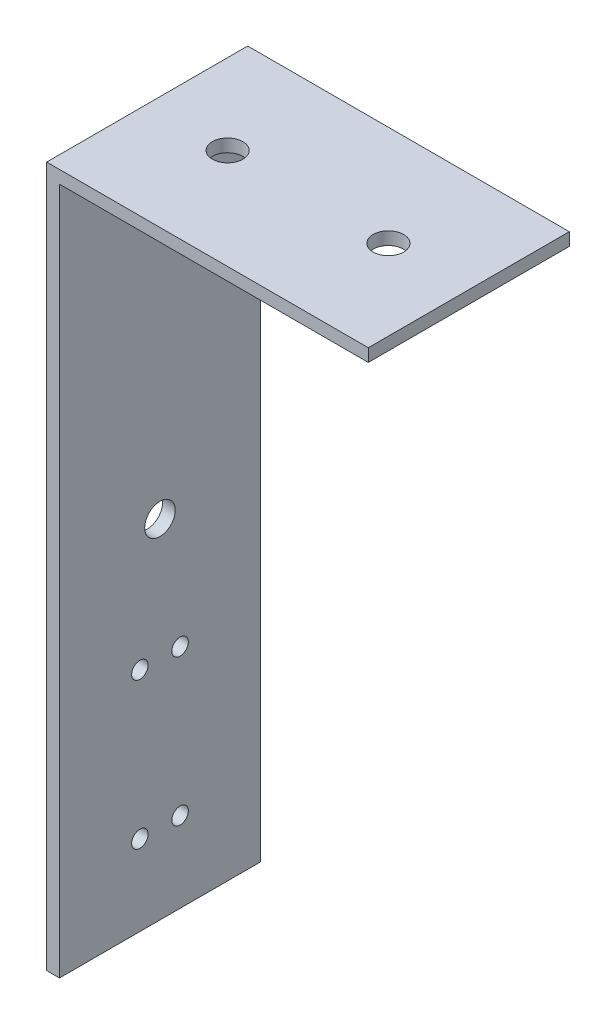
ISO-10303-21;
HEADER;
FILE_DESCRIPTION(('STEP AP214'),'2;1');
FILE_NAME('part.step','',(''),(''),'','','');
FILE_SCHEMA(('AUTOMOTIVE_DESIGN { 1 0 10303 214 1 1 1 1 }'));
ENDSEC;
DATA;
#1=APPLICATION_CONTEXT('core data for automotive mechanical design processes');
#2=APPLICATION_PROTOCOL_DEFINITION('international standard','automotive_design',2000,#1);
#3=PRODUCT_CONTEXT('',#1,'mechanical');
#4=PRODUCT('Part','Part','',(#3));
#5=PRODUCT_RELATED_PRODUCT_CATEGORY('part','',(#4));
#6=PRODUCT_DEFINITION_FORMATION('','',#4);
#7=PRODUCT_DEFINITION_CONTEXT('part definition',#1,'design');
#8=PRODUCT_DEFINITION('design','',#6,#7);
#9=PRODUCT_DEFINITION_SHAPE('','',#8);
#10=(LENGTH_UNIT() NAMED_UNIT(*) SI_UNIT(.MILLI.,.METRE.));
#11=(NAMED_UNIT(*) PLANE_ANGLE_UNIT() SI_UNIT($,.RADIAN.));
#12=(NAMED_UNIT(*) SI_UNIT($,.STERADIAN.) SOLID_ANGLE_UNIT());
#13=UNCERTAINTY_MEASURE_WITH_UNIT(LENGTH_MEASURE(1.E-05),#10,'distance_accuracy_value','');
#14=(GEOMETRIC_REPRESENTATION_CONTEXT(3) GLOBAL_UNCERTAINTY_ASSIGNED_CONTEXT((#13)) GLOBAL_UNIT_ASSIGNED_CONTEXT((#10,
#11,#12)) REPRESENTATION_CONTEXT('',''));
#15=CARTESIAN_POINT('',(0.,0.,0.));
#16=DIRECTION('',(0.,0.,1.));
#17=DIRECTION('',(1.,0.,0.));
#18=AXIS2_PLACEMENT_3D('',#15,#16,#17);
#19=CARTESIAN_POINT('',(0.,0.,25.));
#20=DIRECTION('',(0.,1.,0.));
#21=DIRECTION('',(0.,0.,1.));
#22=AXIS2_PLACEMENT_3D('',#19,#20,#21);
#23=PLANE('',#22);
#24=DIRECTION('',(1.,0.,0.));
#25=VECTOR('',#24,1.);
#26=CARTESIAN_POINT('',(0.,0.,0.));
#27=LINE('',#26,#25);
#28=CARTESIAN_POINT('',(0.,0.,0.));
#29=VERTEX_POINT('',#28);
#30=CARTESIAN_POINT('',(1.5875,0.,0.));
#31=VERTEX_POINT('',#30);
#32=EDGE_CURVE('E119',#29,#31,#27,.T.);
#33=ORIENTED_EDGE('',*,*,#32,.T.);
#34=DIRECTION('',(0.,0.,-1.));
#35=VECTOR('',#34,1.);
#36=CARTESIAN_POINT('',(1.5875,0.,25.));
#37=LINE('',#36,#35);
#38=CARTESIAN_POINT('',(1.5875,0.,25.));
#39=VERTEX_POINT('',#38);
#40=EDGE_CURVE('E11',#39,#31,#37,.T.);
#41=ORIENTED_EDGE('',*,*,#40,.F.);
#42=DIRECTION('',(1.,0.,0.));
#43=VECTOR('',#42,1.);
#44=CARTESIAN_POINT('',(0.,0.,25.));
#45=LINE('',#44,#43);
#46=CARTESIAN_POINT('',(0.,0.,25.));
#47=VERTEX_POINT('',#46);
#48=EDGE_CURVE('E130',#47,#39,#45,.T.);
#49=ORIENTED_EDGE('',*,*,#48,.F.);
#50=DIRECTION('',(0.,0.,-1.));
#51=VECTOR('',#50,1.);
#52=CARTESIAN_POINT('',(0.,0.,25.));
#53=LINE('',#52,#51);
#54=EDGE_CURVE('E115',#47,#29,#53,.T.);
#55=ORIENTED_EDGE('',*,*,#54,.T.);
#56=EDGE_LOOP('',(#33,#41,#49,#55));
#57=FACE_BOUND('',#56,.T.);
#58=ADVANCED_FACE('F35',(#57),#23,.F.);
#59=CARTESIAN_POINT('',(1.5875,0.,25.));
#60=DIRECTION('',(-1.,0.,0.));
#61=DIRECTION('',(0.,0.,1.));
#62=AXIS2_PLACEMENT_3D('',#59,#60,#61);
#63=PLANE('',#62);
#64=CARTESIAN_POINT('',(1.5875,43.2,12.5));
#65=DIRECTION('',(-1.,0.,0.));
#66=DIRECTION('',(0.,0.,1.));
#67=AXIS2_PLACEMENT_3D('',#64,#65,#66);
#68=CIRCLE('',#67,1.89864999999999);
#69=CARTESIAN_POINT('',(1.5875,43.2,14.39865));
#70=VERTEX_POINT('',#69);
#71=EDGE_CURVE('E282',#70,#70,#68,.T.);
#72=ORIENTED_EDGE('',*,*,#71,.T.);
#73=EDGE_LOOP('',(#72));
#74=FACE_BOUND('',#73,.T.);
#75=CARTESIAN_POINT('',(1.5875,9.99999999999999,15.));
#76=DIRECTION('',(-1.,0.,0.));
#77=DIRECTION('',(0.,0.,1.));
#78=AXIS2_PLACEMENT_3D('',#75,#76,#77);
#79=CIRCLE('',#78,1.0287);
#80=CARTESIAN_POINT('',(1.5875,9.99999999999999,16.0287));
#81=VERTEX_POINT('',#80);
#82=EDGE_CURVE('E286',#81,#81,#79,.T.);
#83=ORIENTED_EDGE('',*,*,#82,.T.);
#84=EDGE_LOOP('',(#83));
#85=FACE_BOUND('',#84,.T.);
#86=CARTESIAN_POINT('',(1.5875,28.2,15.));
#87=DIRECTION('',(-1.,0.,0.));
#88=DIRECTION('',(0.,0.,1.));
#89=AXIS2_PLACEMENT_3D('',#86,#87,#88);
#90=CIRCLE('',#89,1.0287);
#91=CARTESIAN_POINT('',(1.5875,28.2,16.0287));
#92=VERTEX_POINT('',#91);
#93=EDGE_CURVE('E295',#92,#92,#90,.T.);
#94=ORIENTED_EDGE('',*,*,#93,.T.);
#95=EDGE_LOOP('',(#94));
#96=FACE_BOUND('',#95,.T.);
#97=CARTESIAN_POINT('',(1.5875,10.,10.));
#98=DIRECTION('',(-1.,0.,0.));
#99=DIRECTION('',(0.,0.,1.));
#100=AXIS2_PLACEMENT_3D('',#97,#98,#99);
#101=CIRCLE('',#100,1.0287);
#102=CARTESIAN_POINT('',(1.5875,10.,11.0287));
#103=VERTEX_POINT('',#102);
#104=EDGE_CURVE('E301',#103,#103,#101,.T.);
#105=ORIENTED_EDGE('',*,*,#104,.T.);
#106=EDGE_LOOP('',(#105));
#107=FACE_BOUND('',#106,.T.);
#108=CARTESIAN_POINT('',(1.5875,28.2,10.));
#109=DIRECTION('',(-1.,0.,0.));
#110=DIRECTION('',(0.,0.,1.));
#111=AXIS2_PLACEMENT_3D('',#108,#109,#110);
#112=CIRCLE('',#111,1.0287);
#113=CARTESIAN_POINT('',(1.5875,28.2,11.0287));
#114=VERTEX_POINT('',#113);
#115=EDGE_CURVE('E307',#114,#114,#112,.T.);
#116=ORIENTED_EDGE('',*,*,#115,.T.);
#117=EDGE_LOOP('',(#116));
#118=FACE_BOUND('',#117,.T.);
#119=DIRECTION('',(0.,1.,0.));
#120=VECTOR('',#119,1.);
#121=CARTESIAN_POINT('',(1.5875,0.,0.));
#122=LINE('',#121,#120);
#123=CARTESIAN_POINT('',(1.5875,85.5125,0.));
#124=VERTEX_POINT('',#123);
#125=EDGE_CURVE('E122',#31,#124,#122,.T.);
#126=ORIENTED_EDGE('',*,*,#125,.T.);
#127=DIRECTION('',(0.,0.,-1.));
#128=VECTOR('',#127,1.);
#129=CARTESIAN_POINT('',(1.5875,85.5125,25.));
#130=LINE('',#129,#128);
#131=CARTESIAN_POINT('',(1.5875,85.5125,25.));
#132=VERTEX_POINT('',#131);
#133=EDGE_CURVE('E43',#132,#124,#130,.T.);
#134=ORIENTED_EDGE('',*,*,#133,.F.);
#135=DIRECTION('',(0.,1.,0.));
#136=VECTOR('',#135,1.);
#137=CARTESIAN_POINT('',(1.5875,0.,25.));
#138=LINE('',#137,#136);
#139=EDGE_CURVE('E88',#39,#132,#138,.T.);
#140=ORIENTED_EDGE('',*,*,#139,.F.);
#141=ORIENTED_EDGE('',*,*,#40,.T.);
#142=EDGE_LOOP('',(#126,#134,#140,#141));
#143=FACE_BOUND('',#142,.T.);
#144=ADVANCED_FACE('F158',(#74,#85,#96,#107,#118,#143),#63,.F.);
#145=CARTESIAN_POINT('',(1.5875,85.5125,25.));
#146=DIRECTION('',(0.,1.,0.));
#147=DIRECTION('',(0.,0.,1.));
#148=AXIS2_PLACEMENT_3D('',#145,#146,#147);
#149=PLANE('',#148);
#150=CARTESIAN_POINT('',(10.,85.5125,12.5));
#151=DIRECTION('',(0.,1.,0.));
#152=DIRECTION('',(0.,0.,1.));
#153=AXIS2_PLACEMENT_3D('',#150,#151,#152);
#154=CIRCLE('',#153,1.89864999999999);
#155=CARTESIAN_POINT('',(10.,85.5125,14.39865));
#156=VERTEX_POINT('',#155);
#157=EDGE_CURVE('E313',#156,#156,#154,.T.);
#158=ORIENTED_EDGE('',*,*,#157,.T.);
#159=EDGE_LOOP('',(#158));
#160=FACE_BOUND('',#159,.T.);
#161=CARTESIAN_POINT('',(30.,85.5125,12.5));
#162=DIRECTION('',(0.,1.,0.));
#163=DIRECTION('',(0.,0.,1.));
#164=AXIS2_PLACEMENT_3D('',#161,#162,#163);
#165=CIRCLE('',#164,1.89864999999999);
#166=CARTESIAN_POINT('',(30.,85.5125,14.39865));
#167=VERTEX_POINT('',#166);
#168=EDGE_CURVE('E123',#167,#167,#165,.T.);
#169=ORIENTED_EDGE('',*,*,#168,.T.);
#170=EDGE_LOOP('',(#169));
#171=FACE_BOUND('',#170,.T.);
#172=DIRECTION('',(1.,0.,0.));
#173=VECTOR('',#172,1.);
#174=CARTESIAN_POINT('',(1.5875,85.5125,0.));
#175=LINE('',#174,#173);
#176=CARTESIAN_POINT('',(40.,85.5125,0.));
#177=VERTEX_POINT('',#176);
#178=EDGE_CURVE('E125',#124,#177,#175,.T.);
#179=ORIENTED_EDGE('',*,*,#178,.T.);
#180=DIRECTION('',(0.,0.,-1.));
#181=VECTOR('',#180,1.);
#182=CARTESIAN_POINT('',(40.,85.5125,25.));
#183=LINE('',#182,#181);
#184=CARTESIAN_POINT('',(40.,85.5125,25.));
#185=VERTEX_POINT('',#184);
#186=EDGE_CURVE('E110',#185,#177,#183,.T.);
#187=ORIENTED_EDGE('',*,*,#186,.F.);
#188=DIRECTION('',(1.,0.,0.));
#189=VECTOR('',#188,1.);
#190=CARTESIAN_POINT('',(1.5875,85.5125,25.));
#191=LINE('',#190,#189);
#192=EDGE_CURVE('E101',#132,#185,#191,.T.);
#193=ORIENTED_EDGE('',*,*,#192,.F.);
#194=ORIENTED_EDGE('',*,*,#133,.T.);
#195=EDGE_LOOP('',(#179,#187,#193,#194));
#196=FACE_BOUND('',#195,.T.);
#197=ADVANCED_FACE('F136',(#160,#171,#196),#149,.F.);
#198=CARTESIAN_POINT('',(40.,87.1,25.));
#199=DIRECTION('',(-1.,0.,0.));
#200=DIRECTION('',(0.,0.,1.));
#201=AXIS2_PLACEMENT_3D('',#198,#199,#200);
#202=PLANE('',#201);
#203=DIRECTION('',(0.,1.,0.));
#204=VECTOR('',#203,1.);
#205=CARTESIAN_POINT('',(40.,87.1,0.));
#206=LINE('',#205,#204);
#207=CARTESIAN_POINT('',(40.,87.1,0.));
#208=VERTEX_POINT('',#207);
#209=EDGE_CURVE('E109',#177,#208,#206,.T.);
#210=ORIENTED_EDGE('',*,*,#209,.T.);
#211=DIRECTION('',(0.,0.,-1.));
#212=VECTOR('',#211,1.);
#213=CARTESIAN_POINT('',(40.,87.1,25.));
#214=LINE('',#213,#212);
#215=CARTESIAN_POINT('',(40.,87.1,25.));
#216=VERTEX_POINT('',#215);
#217=EDGE_CURVE('E106',#216,#208,#214,.T.);
#218=ORIENTED_EDGE('',*,*,#217,.F.);
#219=DIRECTION('',(0.,1.,0.));
#220=VECTOR('',#219,1.);
#221=CARTESIAN_POINT('',(40.,87.1,25.));
#222=LINE('',#221,#220);
#223=EDGE_CURVE('E95',#185,#216,#222,.T.);
#224=ORIENTED_EDGE('',*,*,#223,.F.);
#225=ORIENTED_EDGE('',*,*,#186,.T.);
#226=EDGE_LOOP('',(#210,#218,#224,#225));
#227=FACE_BOUND('',#226,.T.);
#228=ADVANCED_FACE('F107',(#227),#202,.F.);
#229=CARTESIAN_POINT('',(0.,87.1,25.));
#230=DIRECTION('',(0.,-1.,0.));
#231=DIRECTION('',(0.,0.,-1.));
#232=AXIS2_PLACEMENT_3D('',#229,#230,#231);
#233=PLANE('',#232);
#234=CARTESIAN_POINT('',(10.,87.1,12.5));
#235=DIRECTION('',(0.,1.,0.));
#236=DIRECTION('',(0.,0.,1.));
#237=AXIS2_PLACEMENT_3D('',#234,#235,#236);
#238=CIRCLE('',#237,1.89865);
#239=CARTESIAN_POINT('',(10.,87.1,14.39865));
#240=VERTEX_POINT('',#239);
#241=EDGE_CURVE('E310',#240,#240,#238,.T.);
#242=ORIENTED_EDGE('',*,*,#241,.F.);
#243=EDGE_LOOP('',(#242));
#244=FACE_BOUND('',#243,.T.);
#245=CARTESIAN_POINT('',(30.,87.1,12.5));
#246=DIRECTION('',(0.,1.,0.));
#247=DIRECTION('',(0.,0.,1.));
#248=AXIS2_PLACEMENT_3D('',#245,#246,#247);
#249=CIRCLE('',#248,1.89865);
#250=CARTESIAN_POINT('',(30.,87.1,14.39865));
#251=VERTEX_POINT('',#250);
#252=EDGE_CURVE('E316',#251,#251,#249,.T.);
#253=ORIENTED_EDGE('',*,*,#252,.F.);
#254=EDGE_LOOP('',(#253));
#255=FACE_BOUND('',#254,.T.);
#256=DIRECTION('',(-1.,0.,0.));
#257=VECTOR('',#256,1.);
#258=CARTESIAN_POINT('',(0.,87.1,0.));
#259=LINE('',#258,#257);
#260=CARTESIAN_POINT('',(0.,87.1,0.));
#261=VERTEX_POINT('',#260);
#262=EDGE_CURVE('E74',#208,#261,#259,.T.);
#263=ORIENTED_EDGE('',*,*,#262,.T.);
#264=DIRECTION('',(0.,0.,-1.));
#265=VECTOR('',#264,1.);
#266=CARTESIAN_POINT('',(0.,87.1,25.));
#267=LINE('',#266,#265);
#268=CARTESIAN_POINT('',(0.,87.1,25.));
#269=VERTEX_POINT('',#268);
#270=EDGE_CURVE('E111',#269,#261,#267,.T.);
#271=ORIENTED_EDGE('',*,*,#270,.F.);
#272=DIRECTION('',(-1.,0.,0.));
#273=VECTOR('',#272,1.);
#274=CARTESIAN_POINT('',(0.,87.1,25.));
#275=LINE('',#274,#273);
#276=EDGE_CURVE('E99',#216,#269,#275,.T.);
#277=ORIENTED_EDGE('',*,*,#276,.F.);
#278=ORIENTED_EDGE('',*,*,#217,.T.);
#279=EDGE_LOOP('',(#263,#271,#277,#278));
#280=FACE_BOUND('',#279,.T.);
#281=ADVANCED_FACE('F113',(#244,#255,#280),#233,.F.);
#282=CARTESIAN_POINT('',(0.,0.,25.));
#283=DIRECTION('',(1.,0.,0.));
#284=DIRECTION('',(0.,0.,-1.));
#285=AXIS2_PLACEMENT_3D('',#282,#283,#284);
#286=PLANE('',#285);
#287=CARTESIAN_POINT('',(0.,43.2,12.5));
#288=DIRECTION('',(-1.,0.,0.));
#289=DIRECTION('',(0.,0.,1.));
#290=AXIS2_PLACEMENT_3D('',#287,#288,#289);
#291=CIRCLE('',#290,1.89864999999999);
#292=CARTESIAN_POINT('',(0.,43.2,14.39865));
#293=VERTEX_POINT('',#292);
#294=EDGE_CURVE('E280',#293,#293,#291,.T.);
#295=ORIENTED_EDGE('',*,*,#294,.F.);
#296=EDGE_LOOP('',(#295));
#297=FACE_BOUND('',#296,.T.);
#298=CARTESIAN_POINT('',(0.,9.99999999999999,15.));
#299=DIRECTION('',(-1.,0.,0.));
#300=DIRECTION('',(0.,0.,1.));
#301=AXIS2_PLACEMENT_3D('',#298,#299,#300);
#302=CIRCLE('',#301,1.0287);
#303=CARTESIAN_POINT('',(0.,9.99999999999999,16.0287));
#304=VERTEX_POINT('',#303);
#305=EDGE_CURVE('E283',#304,#304,#302,.T.);
#306=ORIENTED_EDGE('',*,*,#305,.F.);
#307=EDGE_LOOP('',(#306));
#308=FACE_BOUND('',#307,.T.);
#309=CARTESIAN_POINT('',(0.,28.2,15.));
#310=DIRECTION('',(-1.,0.,0.));
#311=DIRECTION('',(0.,0.,1.));
#312=AXIS2_PLACEMENT_3D('',#309,#310,#311);
#313=CIRCLE('',#312,1.0287);
#314=CARTESIAN_POINT('',(0.,28.2,16.0287));
#315=VERTEX_POINT('',#314);
#316=EDGE_CURVE('E292',#315,#315,#313,.T.);
#317=ORIENTED_EDGE('',*,*,#316,.F.);
#318=EDGE_LOOP('',(#317));
#319=FACE_BOUND('',#318,.T.);
#320=CARTESIAN_POINT('',(0.,10.,10.));
#321=DIRECTION('',(-1.,0.,0.));
#322=DIRECTION('',(0.,0.,1.));
#323=AXIS2_PLACEMENT_3D('',#320,#321,#322);
#324=CIRCLE('',#323,1.0287);
#325=CARTESIAN_POINT('',(0.,10.,11.0287));
#326=VERTEX_POINT('',#325);
#327=EDGE_CURVE('E298',#326,#326,#324,.T.);
#328=ORIENTED_EDGE('',*,*,#327,.F.);
#329=EDGE_LOOP('',(#328));
#330=FACE_BOUND('',#329,.T.);
#331=CARTESIAN_POINT('',(0.,28.2,10.));
#332=DIRECTION('',(-1.,0.,0.));
#333=DIRECTION('',(0.,0.,1.));
#334=AXIS2_PLACEMENT_3D('',#331,#332,#333);
#335=CIRCLE('',#334,1.0287);
#336=CARTESIAN_POINT('',(0.,28.2,11.0287));
#337=VERTEX_POINT('',#336);
#338=EDGE_CURVE('E304',#337,#337,#335,.T.);
#339=ORIENTED_EDGE('',*,*,#338,.F.);
#340=EDGE_LOOP('',(#339));
#341=FACE_BOUND('',#340,.T.);
#342=DIRECTION('',(0.,-1.,0.));
#343=VECTOR('',#342,1.);
#344=CARTESIAN_POINT('',(0.,0.,0.));
#345=LINE('',#344,#343);
#346=EDGE_CURVE('E80',#261,#29,#345,.T.);
#347=ORIENTED_EDGE('',*,*,#346,.T.);
#348=ORIENTED_EDGE('',*,*,#54,.F.);
#349=DIRECTION('',(0.,-1.,0.));
#350=VECTOR('',#349,1.);
#351=CARTESIAN_POINT('',(0.,0.,25.));
#352=LINE('',#351,#350);
#353=EDGE_CURVE('E51',#269,#47,#352,.T.);
#354=ORIENTED_EDGE('',*,*,#353,.F.);
#355=ORIENTED_EDGE('',*,*,#270,.T.);
#356=EDGE_LOOP('',(#347,#348,#354,#355));
#357=FACE_BOUND('',#356,.T.);
#358=ADVANCED_FACE('F143',(#297,#308,#319,#330,#341,#357),#286,.F.);
#359=CARTESIAN_POINT('',(0.,0.,25.));
#360=DIRECTION('',(0.,0.,1.));
#361=DIRECTION('',(1.,0.,0.));
#362=AXIS2_PLACEMENT_3D('',#359,#360,#361);
#363=PLANE('',#362);
#364=ORIENTED_EDGE('',*,*,#48,.T.);
#365=ORIENTED_EDGE('',*,*,#139,.T.);
#366=ORIENTED_EDGE('',*,*,#192,.T.);
#367=ORIENTED_EDGE('',*,*,#223,.T.);
#368=ORIENTED_EDGE('',*,*,#276,.T.);
#369=ORIENTED_EDGE('',*,*,#353,.T.);
#370=EDGE_LOOP('',(#364,#365,#366,#367,#368,#369));
#371=FACE_BOUND('',#370,.T.);
#372=ADVANCED_FACE('F97',(#371),#363,.T.);
#373=CARTESIAN_POINT('',(0.,0.,0.));
#374=DIRECTION('',(0.,0.,1.));
#375=DIRECTION('',(1.,0.,0.));
#376=AXIS2_PLACEMENT_3D('',#373,#374,#375);
#377=PLANE('',#376);
#378=ORIENTED_EDGE('',*,*,#32,.F.);
#379=ORIENTED_EDGE('',*,*,#346,.F.);
#380=ORIENTED_EDGE('',*,*,#262,.F.);
#381=ORIENTED_EDGE('',*,*,#209,.F.);
#382=ORIENTED_EDGE('',*,*,#178,.F.);
#383=ORIENTED_EDGE('',*,*,#125,.F.);
#384=EDGE_LOOP('',(#378,#379,#380,#381,#382,#383));
#385=FACE_BOUND('',#384,.T.);
#386=ADVANCED_FACE('F139',(#385),#377,.F.);
#387=CARTESIAN_POINT('',(30.,87.1,12.5));
#388=DIRECTION('',(0.,1.,0.));
#389=DIRECTION('',(0.,0.,1.));
#390=AXIS2_PLACEMENT_3D('',#387,#388,#389);
#391=CYLINDRICAL_SURFACE('',#390,1.89864999999999);
#392=ORIENTED_EDGE('',*,*,#252,.T.);
#393=EDGE_LOOP('',(#392));
#394=FACE_BOUND('',#393,.T.);
#395=ORIENTED_EDGE('',*,*,#168,.F.);
#396=EDGE_LOOP('',(#395));
#397=FACE_BOUND('',#396,.T.);
#398=ADVANCED_FACE('F190',(#394,#397),#391,.F.);
#399=CARTESIAN_POINT('',(10.,87.1,12.5));
#400=DIRECTION('',(0.,1.,0.));
#401=DIRECTION('',(0.,0.,1.));
#402=AXIS2_PLACEMENT_3D('',#399,#400,#401);
#403=CYLINDRICAL_SURFACE('',#402,1.89864999999999);
#404=ORIENTED_EDGE('',*,*,#241,.T.);
#405=EDGE_LOOP('',(#404));
#406=FACE_BOUND('',#405,.T.);
#407=ORIENTED_EDGE('',*,*,#157,.F.);
#408=EDGE_LOOP('',(#407));
#409=FACE_BOUND('',#408,.T.);
#410=ADVANCED_FACE('F195',(#406,#409),#403,.F.);
#411=CARTESIAN_POINT('',(0.,28.2,10.));
#412=DIRECTION('',(-1.,0.,0.));
#413=DIRECTION('',(0.,0.,1.));
#414=AXIS2_PLACEMENT_3D('',#411,#412,#413);
#415=CYLINDRICAL_SURFACE('',#414,1.0287);
#416=ORIENTED_EDGE('',*,*,#338,.T.);
#417=EDGE_LOOP('',(#416));
#418=FACE_BOUND('',#417,.T.);
#419=ORIENTED_EDGE('',*,*,#115,.F.);
#420=EDGE_LOOP('',(#419));
#421=FACE_BOUND('',#420,.T.);
#422=ADVANCED_FACE('F207',(#418,#421),#415,.F.);
#423=CARTESIAN_POINT('',(0.,10.,10.));
#424=DIRECTION('',(-1.,0.,0.));
#425=DIRECTION('',(0.,0.,1.));
#426=AXIS2_PLACEMENT_3D('',#423,#424,#425);
#427=CYLINDRICAL_SURFACE('',#426,1.0287);
#428=ORIENTED_EDGE('',*,*,#327,.T.);
#429=EDGE_LOOP('',(#428));
#430=FACE_BOUND('',#429,.T.);
#431=ORIENTED_EDGE('',*,*,#104,.F.);
#432=EDGE_LOOP('',(#431));
#433=FACE_BOUND('',#432,.T.);
#434=ADVANCED_FACE('F217',(#430,#433),#427,.F.);
#435=CARTESIAN_POINT('',(0.,28.2,15.));
#436=DIRECTION('',(-1.,0.,0.));
#437=DIRECTION('',(0.,0.,1.));
#438=AXIS2_PLACEMENT_3D('',#435,#436,#437);
#439=CYLINDRICAL_SURFACE('',#438,1.0287);
#440=ORIENTED_EDGE('',*,*,#316,.T.);
#441=EDGE_LOOP('',(#440));
#442=FACE_BOUND('',#441,.T.);
#443=ORIENTED_EDGE('',*,*,#93,.F.);
#444=EDGE_LOOP('',(#443));
#445=FACE_BOUND('',#444,.T.);
#446=ADVANCED_FACE('F227',(#442,#445),#439,.F.);
#447=CARTESIAN_POINT('',(0.,9.99999999999999,15.));
#448=DIRECTION('',(-1.,0.,0.));
#449=DIRECTION('',(0.,0.,1.));
#450=AXIS2_PLACEMENT_3D('',#447,#448,#449);
#451=CYLINDRICAL_SURFACE('',#450,1.0287);
#452=ORIENTED_EDGE('',*,*,#305,.T.);
#453=EDGE_LOOP('',(#452));
#454=FACE_BOUND('',#453,.T.);
#455=ORIENTED_EDGE('',*,*,#82,.F.);
#456=EDGE_LOOP('',(#455));
#457=FACE_BOUND('',#456,.T.);
#458=ADVANCED_FACE('F237',(#454,#457),#451,.F.);
#459=CARTESIAN_POINT('',(0.,43.2,12.5));
#460=DIRECTION('',(-1.,0.,0.));
#461=DIRECTION('',(0.,0.,1.));
#462=AXIS2_PLACEMENT_3D('',#459,#460,#461);
#463=CYLINDRICAL_SURFACE('',#462,1.89864999999999);
#464=ORIENTED_EDGE('',*,*,#294,.T.);
#465=EDGE_LOOP('',(#464));
#466=FACE_BOUND('',#465,.T.);
#467=ORIENTED_EDGE('',*,*,#71,.F.);
#468=EDGE_LOOP('',(#467));
#469=FACE_BOUND('',#468,.T.);
#470=ADVANCED_FACE('F246',(#466,#469),#463,.F.);
#471=CLOSED_SHELL('',(#58,#144,#197,#228,#281,#358,#372,#386,#398,#410,#422,#434,#446,#458,#470));
#472=MANIFOLD_SOLID_BREP('B2',#471);
#473=ADVANCED_BREP_SHAPE_REPRESENTATION('',(#18,#472),#14);
#474=SHAPE_DEFINITION_REPRESENTATION(#9,#473);
ENDSEC;
END-ISO-10303-21;
